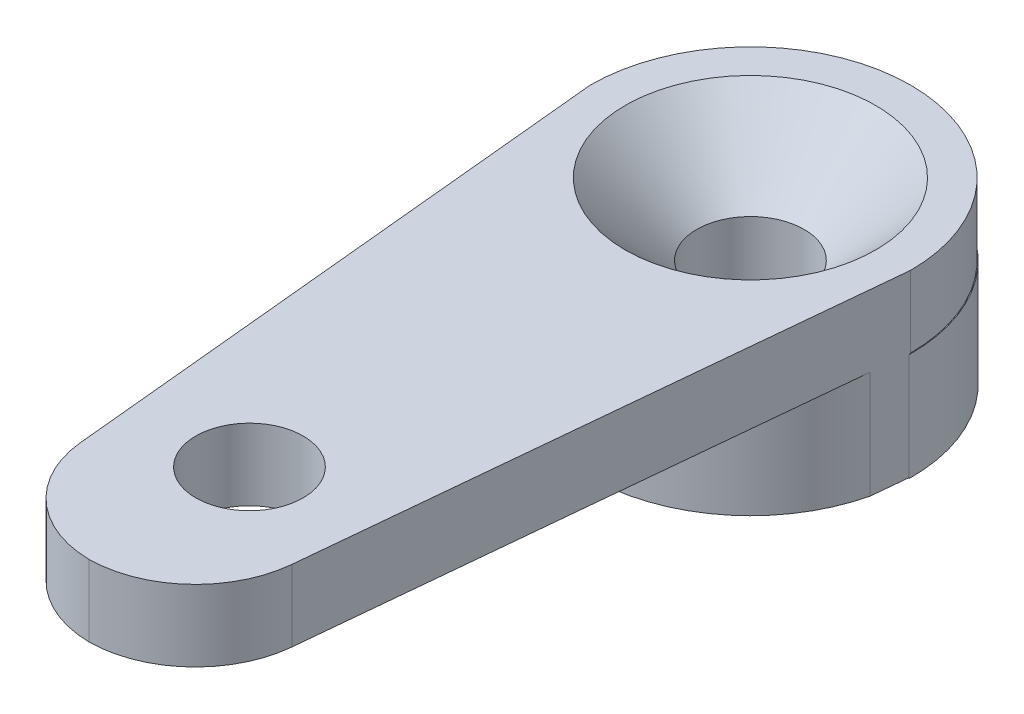
ISO-10303-21;
HEADER;
FILE_DESCRIPTION(('STEP AP214'),'2;1');
FILE_NAME('part.step','',(''),(''),'','','');
FILE_SCHEMA(('AUTOMOTIVE_DESIGN { 1 0 10303 214 1 1 1 1 }'));
ENDSEC;
DATA;
#1=APPLICATION_CONTEXT('core data for automotive mechanical design processes');
#2=APPLICATION_PROTOCOL_DEFINITION('international standard','automotive_design',2000,#1);
#3=PRODUCT_CONTEXT('',#1,'mechanical');
#4=PRODUCT('Part','Part','',(#3));
#5=PRODUCT_RELATED_PRODUCT_CATEGORY('part','',(#4));
#6=PRODUCT_DEFINITION_FORMATION('','',#4);
#7=PRODUCT_DEFINITION_CONTEXT('part definition',#1,'design');
#8=PRODUCT_DEFINITION('design','',#6,#7);
#9=PRODUCT_DEFINITION_SHAPE('','',#8);
#10=(LENGTH_UNIT() NAMED_UNIT(*) SI_UNIT(.MILLI.,.METRE.));
#11=(NAMED_UNIT(*) PLANE_ANGLE_UNIT() SI_UNIT($,.RADIAN.));
#12=(NAMED_UNIT(*) SI_UNIT($,.STERADIAN.) SOLID_ANGLE_UNIT());
#13=UNCERTAINTY_MEASURE_WITH_UNIT(LENGTH_MEASURE(1.E-05),#10,'distance_accuracy_value','');
#14=(GEOMETRIC_REPRESENTATION_CONTEXT(3) GLOBAL_UNCERTAINTY_ASSIGNED_CONTEXT((#13)) GLOBAL_UNIT_ASSIGNED_CONTEXT((#10,
#11,#12)) REPRESENTATION_CONTEXT('',''));
#15=CARTESIAN_POINT('',(0.,0.,0.));
#16=DIRECTION('',(0.,0.,1.));
#17=DIRECTION('',(1.,0.,0.));
#18=AXIS2_PLACEMENT_3D('',#15,#16,#17);
#19=CARTESIAN_POINT('',(0.,3.,0.));
#20=DIRECTION('',(0.,-1.,0.));
#21=DIRECTION('',(0.,0.,-1.));
#22=AXIS2_PLACEMENT_3D('',#19,#20,#21);
#23=CYLINDRICAL_SURFACE('',#22,4.5);
#24=CARTESIAN_POINT('',(0.,3.,0.));
#25=DIRECTION('',(0.,1.,0.));
#26=DIRECTION('',(0.,0.,1.));
#27=AXIS2_PLACEMENT_3D('',#24,#25,#26);
#28=CIRCLE('',#27,4.5);
#29=CARTESIAN_POINT('',(4.49955660508697,3.,0.0631692774870343));
#30=VERTEX_POINT('',#29);
#31=CARTESIAN_POINT('',(-4.49981233239338,3.,0.0410971196130826));
#32=VERTEX_POINT('',#31);
#33=EDGE_CURVE('E168',#30,#32,#28,.T.);
#34=ORIENTED_EDGE('',*,*,#33,.F.);
#35=DIRECTION('',(0.,-1.,0.));
#36=VECTOR('',#35,1.);
#37=CARTESIAN_POINT('',(4.49955660508697,3.,0.0631692774870343));
#38=LINE('',#37,#36);
#39=CARTESIAN_POINT('',(4.49955660508697,0.,0.0631692774870291));
#40=VERTEX_POINT('',#39);
#41=EDGE_CURVE('E248',#30,#40,#38,.T.);
#42=ORIENTED_EDGE('',*,*,#41,.T.);
#43=CARTESIAN_POINT('',(0.,0.,0.));
#44=DIRECTION('',(0.,1.,0.));
#45=DIRECTION('',(0.,0.,1.));
#46=AXIS2_PLACEMENT_3D('',#43,#44,#45);
#47=CIRCLE('',#46,4.5);
#48=CARTESIAN_POINT('',(-4.49981233239338,0.,0.0410971196130806));
#49=VERTEX_POINT('',#48);
#50=EDGE_CURVE('E163',#40,#49,#47,.T.);
#51=ORIENTED_EDGE('',*,*,#50,.T.);
#52=DIRECTION('',(0.,-1.,0.));
#53=VECTOR('',#52,1.);
#54=CARTESIAN_POINT('',(-4.49981233239338,3.,0.0410971196130826));
#55=LINE('',#54,#53);
#56=EDGE_CURVE('E259',#49,#32,#55,.F.);
#57=ORIENTED_EDGE('',*,*,#56,.T.);
#58=EDGE_LOOP('',(#34,#42,#51,#57));
#59=FACE_BOUND('',#58,.T.);
#60=ADVANCED_FACE('F50',(#59),#23,.T.);
#61=CARTESIAN_POINT('',(-4.37934467093334,0.,1.0350556763613));
#62=VERTEX_POINT('',#61);
#63=CARTESIAN_POINT('',(4.37934467093334,0.,1.0350556763613));
#64=VERTEX_POINT('',#63);
#65=EDGE_CURVE('E158',#62,#64,#47,.T.);
#66=ORIENTED_EDGE('',*,*,#65,.T.);
#67=DIRECTION('',(0.,-1.,0.));
#68=VECTOR('',#67,1.);
#69=CARTESIAN_POINT('',(4.37934467093334,3.,1.0350556763613));
#70=LINE('',#69,#68);
#71=CARTESIAN_POINT('',(4.37934467093335,3.,1.03505567636129));
#72=VERTEX_POINT('',#71);
#73=EDGE_CURVE('E236',#64,#72,#70,.F.);
#74=ORIENTED_EDGE('',*,*,#73,.T.);
#75=CARTESIAN_POINT('',(-4.37934467093334,3.,1.0350556763613));
#76=VERTEX_POINT('',#75);
#77=EDGE_CURVE('E172',#76,#72,#28,.T.);
#78=ORIENTED_EDGE('',*,*,#77,.F.);
#79=DIRECTION('',(0.,-1.,0.));
#80=VECTOR('',#79,1.);
#81=CARTESIAN_POINT('',(-4.37934467093334,3.,1.0350556763613));
#82=LINE('',#81,#80);
#83=EDGE_CURVE('E200',#76,#62,#82,.T.);
#84=ORIENTED_EDGE('',*,*,#83,.T.);
#85=EDGE_LOOP('',(#66,#74,#78,#84));
#86=FACE_BOUND('',#85,.T.);
#87=ADVANCED_FACE('F291',(#86),#23,.T.);
#88=CARTESIAN_POINT('',(0.,3.,0.));
#89=DIRECTION('',(0.,1.,0.));
#90=DIRECTION('',(0.,0.,1.));
#91=AXIS2_PLACEMENT_3D('',#88,#89,#90);
#92=PLANE('',#91);
#93=DIRECTION('',(-0.299614813266294,0.,-0.954060251593894));
#94=VECTOR('',#93,1.);
#95=CARTESIAN_POINT('',(4.07757876987385,3.,-1.28053023870697));
#96=LINE('',#95,#94);
#97=CARTESIAN_POINT('',(4.47971881051705,3.,0.));
#98=VERTEX_POINT('',#97);
#99=EDGE_CURVE('E252',#30,#98,#96,.T.);
#100=ORIENTED_EDGE('',*,*,#99,.F.);
#101=ORIENTED_EDGE('',*,*,#33,.T.);
#102=DIRECTION('',(-0.439238302679607,0.,0.898370588042117));
#103=VECTOR('',#102,1.);
#104=CARTESIAN_POINT('',(-3.61544537678151,3.,-1.76769154273992));
#105=LINE('',#104,#103);
#106=CARTESIAN_POINT('',(-4.47971881051705,3.,0.));
#107=VERTEX_POINT('',#106);
#108=EDGE_CURVE('E263',#107,#32,#105,.T.);
#109=ORIENTED_EDGE('',*,*,#108,.F.);
#110=CARTESIAN_POINT('',(0.,3.,0.));
#111=DIRECTION('',(0.,1.,0.));
#112=DIRECTION('',(0.,0.,1.));
#113=AXIS2_PLACEMENT_3D('',#110,#111,#112);
#114=CIRCLE('',#113,4.47971881051705);
#115=EDGE_CURVE('E152',#98,#107,#114,.T.);
#116=ORIENTED_EDGE('',*,*,#115,.F.);
#117=EDGE_LOOP('',(#100,#101,#109,#116));
#118=FACE_BOUND('',#117,.T.);
#119=ADVANCED_FACE('F298',(#118),#92,.T.);
#120=CARTESIAN_POINT('',(0.,0.,0.));
#121=DIRECTION('',(0.,1.,0.));
#122=DIRECTION('',(0.,0.,1.));
#123=AXIS2_PLACEMENT_3D('',#120,#121,#122);
#124=PLANE('',#123);
#125=CARTESIAN_POINT('',(0.,0.,0.));
#126=DIRECTION('',(0.,1.,0.));
#127=DIRECTION('',(0.,0.,1.));
#128=AXIS2_PLACEMENT_3D('',#125,#126,#127);
#129=CIRCLE('',#128,1.5);
#130=CARTESIAN_POINT('',(0.,0.,1.5));
#131=VERTEX_POINT('',#130);
#132=EDGE_CURVE('E266',#131,#131,#129,.T.);
#133=ORIENTED_EDGE('',*,*,#132,.T.);
#134=EDGE_LOOP('',(#133));
#135=FACE_BOUND('',#134,.T.);
#136=ORIENTED_EDGE('',*,*,#50,.F.);
#137=DIRECTION('',(-0.299614813266294,0.,-0.954060251593894));
#138=VECTOR('',#137,1.);
#139=CARTESIAN_POINT('',(4.07757876987385,0.,-1.28053023870697));
#140=LINE('',#139,#138);
#141=CARTESIAN_POINT('',(4.47971881051705,0.,0.));
#142=VERTEX_POINT('',#141);
#143=EDGE_CURVE('E244',#40,#142,#140,.T.);
#144=ORIENTED_EDGE('',*,*,#143,.T.);
#145=DIRECTION('',(-0.0965218409295913,0.,0.995330866708937));
#146=VECTOR('',#145,1.);
#147=CARTESIAN_POINT('',(4.43798366353081,0.,0.430371816595848));
#148=LINE('',#147,#146);
#149=EDGE_CURVE('E240',#142,#64,#148,.T.);
#150=ORIENTED_EDGE('',*,*,#149,.T.);
#151=ORIENTED_EDGE('',*,*,#65,.F.);
#152=DIRECTION('',(-0.0965218409295915,0.,-0.995330866708936));
#153=VECTOR('',#152,1.);
#154=CARTESIAN_POINT('',(-4.4379836635308,0.,0.430371816595849));
#155=LINE('',#154,#153);
#156=CARTESIAN_POINT('',(-4.47971881051705,0.,0.));
#157=VERTEX_POINT('',#156);
#158=EDGE_CURVE('E229',#62,#157,#155,.T.);
#159=ORIENTED_EDGE('',*,*,#158,.T.);
#160=DIRECTION('',(-0.439238302679607,0.,0.898370588042117));
#161=VECTOR('',#160,1.);
#162=CARTESIAN_POINT('',(-3.61544537678151,0.,-1.76769154273992));
#163=LINE('',#162,#161);
#164=EDGE_CURVE('E255',#157,#49,#163,.T.);
#165=ORIENTED_EDGE('',*,*,#164,.T.);
#166=EDGE_LOOP('',(#136,#144,#150,#151,#159,#165));
#167=FACE_BOUND('',#166,.T.);
#168=ADVANCED_FACE('F272',(#135,#167),#124,.F.);
#169=CARTESIAN_POINT('',(0.,3.,0.));
#170=DIRECTION('',(0.,1.,0.));
#171=DIRECTION('',(0.,0.,1.));
#172=AXIS2_PLACEMENT_3D('',#169,#170,#171);
#173=PLANE('',#172);
#174=CARTESIAN_POINT('',(0.,3.,14.));
#175=DIRECTION('',(0.,1.,0.));
#176=DIRECTION('',(0.,0.,1.));
#177=AXIS2_PLACEMENT_3D('',#174,#175,#176);
#178=CIRCLE('',#177,1.5);
#179=CARTESIAN_POINT('',(0.,3.,15.5));
#180=VERTEX_POINT('',#179);
#181=EDGE_CURVE('E209',#180,#180,#178,.T.);
#182=ORIENTED_EDGE('',*,*,#181,.T.);
#183=EDGE_LOOP('',(#182));
#184=FACE_BOUND('',#183,.T.);
#185=CARTESIAN_POINT('',(-0.0354530852805608,3.,15.479294033295));
#186=DIRECTION('',(0.,1.,0.));
#187=DIRECTION('',(0.,0.,1.));
#188=AXIS2_PLACEMENT_3D('',#185,#186,#187);
#189=CIRCLE('',#188,3.);
#190=CARTESIAN_POINT('',(2.95053951484625,3.,15.7688595560837));
#191=VERTEX_POINT('',#190);
#192=CARTESIAN_POINT('',(0.,3.,18.4790845391043));
#193=VERTEX_POINT('',#192);
#194=EDGE_CURVE('E67',#191,#193,#189,.F.);
#195=ORIENTED_EDGE('',*,*,#194,.T.);
#196=CARTESIAN_POINT('',(0.0354530852805656,3.,15.479294033295));
#197=DIRECTION('',(0.,1.,0.));
#198=DIRECTION('',(0.,0.,1.));
#199=AXIS2_PLACEMENT_3D('',#196,#197,#198);
#200=CIRCLE('',#199,3.);
#201=CARTESIAN_POINT('',(-2.95053951484624,3.,15.7688595560837));
#202=VERTEX_POINT('',#201);
#203=EDGE_CURVE('E60',#193,#202,#200,.F.);
#204=ORIENTED_EDGE('',*,*,#203,.T.);
#205=DIRECTION('',(-0.0965218409295915,0.,-0.995330866708936));
#206=VECTOR('',#205,1.);
#207=CARTESIAN_POINT('',(-4.4379836635308,3.,0.430371816595849));
#208=LINE('',#207,#206);
#209=EDGE_CURVE('E195',#202,#76,#208,.T.);
#210=ORIENTED_EDGE('',*,*,#209,.T.);
#211=ORIENTED_EDGE('',*,*,#77,.T.);
#212=DIRECTION('',(-0.0965218409295913,0.,0.995330866708937));
#213=VECTOR('',#212,1.);
#214=CARTESIAN_POINT('',(4.43798366353081,3.,0.430371816595848));
#215=LINE('',#214,#213);
#216=EDGE_CURVE('E233',#72,#191,#215,.T.);
#217=ORIENTED_EDGE('',*,*,#216,.T.);
#218=EDGE_LOOP('',(#195,#204,#210,#211,#217));
#219=FACE_BOUND('',#218,.T.);
#220=ADVANCED_FACE('F193',(#184,#219),#173,.F.);
#221=CARTESIAN_POINT('',(0.,5.,0.));
#222=DIRECTION('',(0.,-1.,0.));
#223=DIRECTION('',(0.,0.,-1.));
#224=AXIS2_PLACEMENT_3D('',#221,#222,#223);
#225=CYLINDRICAL_SURFACE('',#224,4.47971881051705);
#226=ORIENTED_EDGE('',*,*,#115,.T.);
#227=DIRECTION('',(0.,-1.,0.));
#228=VECTOR('',#227,1.);
#229=CARTESIAN_POINT('',(-4.47971881051705,5.,0.));
#230=LINE('',#229,#228);
#231=CARTESIAN_POINT('',(-4.47971881051705,5.,0.));
#232=VERTEX_POINT('',#231);
#233=EDGE_CURVE('E134',#232,#107,#230,.T.);
#234=ORIENTED_EDGE('',*,*,#233,.F.);
#235=CARTESIAN_POINT('',(0.,5.,0.));
#236=DIRECTION('',(0.,1.,0.));
#237=DIRECTION('',(0.,0.,1.));
#238=AXIS2_PLACEMENT_3D('',#235,#236,#237);
#239=CIRCLE('',#238,4.47971881051705);
#240=CARTESIAN_POINT('',(4.47971881051705,5.,0.));
#241=VERTEX_POINT('',#240);
#242=EDGE_CURVE('E144',#241,#232,#239,.T.);
#243=ORIENTED_EDGE('',*,*,#242,.F.);
#244=DIRECTION('',(0.,-1.,0.));
#245=VECTOR('',#244,1.);
#246=CARTESIAN_POINT('',(4.47971881051705,5.,0.));
#247=LINE('',#246,#245);
#248=EDGE_CURVE('E151',#241,#98,#247,.T.);
#249=ORIENTED_EDGE('',*,*,#248,.T.);
#250=EDGE_LOOP('',(#226,#234,#243,#249));
#251=FACE_BOUND('',#250,.T.);
#252=ADVANCED_FACE('F155',(#251),#225,.T.);
#253=CARTESIAN_POINT('',(0.,5.,0.));
#254=DIRECTION('',(0.,1.,0.));
#255=DIRECTION('',(0.,0.,1.));
#256=AXIS2_PLACEMENT_3D('',#253,#254,#255);
#257=PLANE('',#256);
#258=CARTESIAN_POINT('',(0.,5.,14.));
#259=DIRECTION('',(0.,1.,0.));
#260=DIRECTION('',(0.,0.,1.));
#261=AXIS2_PLACEMENT_3D('',#258,#259,#260);
#262=CIRCLE('',#261,1.5);
#263=CARTESIAN_POINT('',(0.,5.,15.5));
#264=VERTEX_POINT('',#263);
#265=EDGE_CURVE('E212',#264,#264,#262,.T.);
#266=ORIENTED_EDGE('',*,*,#265,.F.);
#267=EDGE_LOOP('',(#266));
#268=FACE_BOUND('',#267,.T.);
#269=DIRECTION('',(-0.0965218409295915,0.,-0.995330866708936));
#270=VECTOR('',#269,1.);
#271=CARTESIAN_POINT('',(-4.47971881051705,5.,0.));
#272=LINE('',#271,#270);
#273=CARTESIAN_POINT('',(-2.95053951484624,5.,15.7688595560837));
#274=VERTEX_POINT('',#273);
#275=EDGE_CURVE('E128',#274,#232,#272,.T.);
#276=ORIENTED_EDGE('',*,*,#275,.F.);
#277=CARTESIAN_POINT('',(0.0354530852805656,5.,15.479294033295));
#278=DIRECTION('',(0.,1.,0.));
#279=DIRECTION('',(0.,0.,1.));
#280=AXIS2_PLACEMENT_3D('',#277,#278,#279);
#281=CIRCLE('',#280,3.);
#282=CARTESIAN_POINT('',(0.,5.,18.4790845391043));
#283=VERTEX_POINT('',#282);
#284=EDGE_CURVE('E186',#274,#283,#281,.T.);
#285=ORIENTED_EDGE('',*,*,#284,.T.);
#286=CARTESIAN_POINT('',(-0.0354530852805608,5.,15.479294033295));
#287=DIRECTION('',(0.,1.,0.));
#288=DIRECTION('',(0.,0.,1.));
#289=AXIS2_PLACEMENT_3D('',#286,#287,#288);
#290=CIRCLE('',#289,3.);
#291=CARTESIAN_POINT('',(2.95053951484625,5.,15.7688595560837));
#292=VERTEX_POINT('',#291);
#293=EDGE_CURVE('E183',#283,#292,#290,.T.);
#294=ORIENTED_EDGE('',*,*,#293,.T.);
#295=DIRECTION('',(-0.0965218409295912,0.,0.995330866708936));
#296=VECTOR('',#295,1.);
#297=CARTESIAN_POINT('',(4.47971881051705,5.,0.));
#298=LINE('',#297,#296);
#299=EDGE_CURVE('E147',#241,#292,#298,.T.);
#300=ORIENTED_EDGE('',*,*,#299,.F.);
#301=ORIENTED_EDGE('',*,*,#242,.T.);
#302=EDGE_LOOP('',(#276,#285,#294,#300,#301));
#303=FACE_BOUND('',#302,.T.);
#304=CARTESIAN_POINT('',(0.,5.,0.));
#305=DIRECTION('',(0.,1.,0.));
#306=DIRECTION('',(0.,0.,1.));
#307=AXIS2_PLACEMENT_3D('',#304,#305,#306);
#308=CIRCLE('',#307,3.50000000000001);
#309=CARTESIAN_POINT('',(0.,5.,3.50000000000001));
#310=VERTEX_POINT('',#309);
#311=EDGE_CURVE('E177',#310,#310,#308,.F.);
#312=ORIENTED_EDGE('',*,*,#311,.T.);
#313=EDGE_LOOP('',(#312));
#314=FACE_BOUND('',#313,.T.);
#315=ADVANCED_FACE('F145',(#268,#303,#314),#257,.T.);
#316=CARTESIAN_POINT('',(0.,-27.,0.));
#317=DIRECTION('',(0.,1.,0.));
#318=DIRECTION('',(0.,0.,1.));
#319=AXIS2_PLACEMENT_3D('',#316,#317,#318);
#320=CYLINDRICAL_SURFACE('',#319,1.5);
#321=CARTESIAN_POINT('',(0.,3.,0.));
#322=DIRECTION('',(0.,1.,0.));
#323=DIRECTION('',(0.,0.,1.));
#324=AXIS2_PLACEMENT_3D('',#321,#322,#323);
#325=CIRCLE('',#324,1.5);
#326=CARTESIAN_POINT('',(0.,3.,1.5));
#327=VERTEX_POINT('',#326);
#328=EDGE_CURVE('E171',#327,#327,#325,.T.);
#329=ORIENTED_EDGE('',*,*,#328,.T.);
#330=EDGE_LOOP('',(#329));
#331=FACE_BOUND('',#330,.T.);
#332=ORIENTED_EDGE('',*,*,#132,.F.);
#333=EDGE_LOOP('',(#332));
#334=FACE_BOUND('',#333,.T.);
#335=ADVANCED_FACE('F275',(#331,#334),#320,.F.);
#336=CARTESIAN_POINT('',(0.,3.,0.));
#337=DIRECTION('',(0.,1.,0.));
#338=DIRECTION('',(0.,0.,1.));
#339=AXIS2_PLACEMENT_3D('',#336,#337,#338);
#340=CONICAL_SURFACE('',#339,1.5,0.785398163397449);
#341=ORIENTED_EDGE('',*,*,#311,.F.);
#342=EDGE_LOOP('',(#341));
#343=FACE_BOUND('',#342,.T.);
#344=ORIENTED_EDGE('',*,*,#328,.F.);
#345=EDGE_LOOP('',(#344));
#346=FACE_BOUND('',#345,.T.);
#347=ADVANCED_FACE('F277',(#343,#346),#340,.F.);
#348=CARTESIAN_POINT('',(-4.47971881051705,-27.,0.));
#349=DIRECTION('',(0.995330866708936,0.,-0.0965218409295915));
#350=DIRECTION('',(-0.0965218409295915,0.,-0.995330866708936));
#351=AXIS2_PLACEMENT_3D('',#348,#349,#350);
#352=PLANE('',#351);
#353=ORIENTED_EDGE('',*,*,#209,.F.);
#354=DIRECTION('',(0.,-1.,0.));
#355=VECTOR('',#354,1.);
#356=CARTESIAN_POINT('',(-2.95053951484624,-27.,15.7688595560837));
#357=LINE('',#356,#355);
#358=EDGE_CURVE('E137',#202,#274,#357,.F.);
#359=ORIENTED_EDGE('',*,*,#358,.T.);
#360=ORIENTED_EDGE('',*,*,#275,.T.);
#361=ORIENTED_EDGE('',*,*,#233,.T.);
#362=DIRECTION('',(0.,1.,0.));
#363=VECTOR('',#362,1.);
#364=CARTESIAN_POINT('',(-4.47971881051705,-27.,0.));
#365=LINE('',#364,#363);
#366=EDGE_CURVE('E140',#157,#107,#365,.T.);
#367=ORIENTED_EDGE('',*,*,#366,.F.);
#368=ORIENTED_EDGE('',*,*,#158,.F.);
#369=ORIENTED_EDGE('',*,*,#83,.F.);
#370=EDGE_LOOP('',(#353,#359,#360,#361,#367,#368,#369));
#371=FACE_BOUND('',#370,.T.);
#372=ADVANCED_FACE('F131',(#371),#352,.F.);
#373=CARTESIAN_POINT('',(-4.47971881051705,-27.,0.));
#374=DIRECTION('',(-0.898370588042117,0.,-0.439238302679607));
#375=DIRECTION('',(-0.439238302679607,0.,0.898370588042117));
#376=AXIS2_PLACEMENT_3D('',#373,#374,#375);
#377=PLANE('',#376);
#378=ORIENTED_EDGE('',*,*,#108,.T.);
#379=ORIENTED_EDGE('',*,*,#56,.F.);
#380=ORIENTED_EDGE('',*,*,#164,.F.);
#381=ORIENTED_EDGE('',*,*,#366,.T.);
#382=EDGE_LOOP('',(#378,#379,#380,#381));
#383=FACE_BOUND('',#382,.T.);
#384=ADVANCED_FACE('F321',(#383),#377,.F.);
#385=CARTESIAN_POINT('',(4.47971881051705,-27.,0.));
#386=DIRECTION('',(-0.995330866708936,0.,-0.0965218409295912));
#387=DIRECTION('',(-0.0965218409295913,0.,0.995330866708937));
#388=AXIS2_PLACEMENT_3D('',#385,#386,#387);
#389=PLANE('',#388);
#390=ORIENTED_EDGE('',*,*,#299,.T.);
#391=DIRECTION('',(0.,-1.,0.));
#392=VECTOR('',#391,1.);
#393=CARTESIAN_POINT('',(2.95053951484625,-27.,15.7688595560837));
#394=LINE('',#393,#392);
#395=EDGE_CURVE('E13',#292,#191,#394,.T.);
#396=ORIENTED_EDGE('',*,*,#395,.T.);
#397=ORIENTED_EDGE('',*,*,#216,.F.);
#398=ORIENTED_EDGE('',*,*,#73,.F.);
#399=ORIENTED_EDGE('',*,*,#149,.F.);
#400=DIRECTION('',(0.,1.,0.));
#401=VECTOR('',#400,1.);
#402=CARTESIAN_POINT('',(4.47971881051705,-27.,0.));
#403=LINE('',#402,#401);
#404=EDGE_CURVE('E203',#142,#98,#403,.T.);
#405=ORIENTED_EDGE('',*,*,#404,.T.);
#406=ORIENTED_EDGE('',*,*,#248,.F.);
#407=EDGE_LOOP('',(#390,#396,#397,#398,#399,#405,#406));
#408=FACE_BOUND('',#407,.T.);
#409=ADVANCED_FACE('F315',(#408),#389,.F.);
#410=CARTESIAN_POINT('',(4.47971881051705,-27.,0.));
#411=DIRECTION('',(0.954060251593894,0.,-0.299614813266294));
#412=DIRECTION('',(-0.299614813266294,0.,-0.954060251593894));
#413=AXIS2_PLACEMENT_3D('',#410,#411,#412);
#414=PLANE('',#413);
#415=ORIENTED_EDGE('',*,*,#99,.T.);
#416=ORIENTED_EDGE('',*,*,#404,.F.);
#417=ORIENTED_EDGE('',*,*,#143,.F.);
#418=ORIENTED_EDGE('',*,*,#41,.F.);
#419=EDGE_LOOP('',(#415,#416,#417,#418));
#420=FACE_BOUND('',#419,.T.);
#421=ADVANCED_FACE('F311',(#420),#414,.F.);
#422=CARTESIAN_POINT('',(-0.0354530852805608,5.,15.479294033295));
#423=DIRECTION('',(0.,-1.,0.));
#424=DIRECTION('',(0.,0.,-1.));
#425=AXIS2_PLACEMENT_3D('',#422,#423,#424);
#426=CYLINDRICAL_SURFACE('',#425,3.);
#427=DIRECTION('',(0.,-1.,0.));
#428=VECTOR('',#427,1.);
#429=CARTESIAN_POINT('',(0.,4.,18.4790845391043));
#430=LINE('',#429,#428);
#431=EDGE_CURVE('E54',#193,#283,#430,.F.);
#432=ORIENTED_EDGE('',*,*,#431,.F.);
#433=ORIENTED_EDGE('',*,*,#194,.F.);
#434=ORIENTED_EDGE('',*,*,#395,.F.);
#435=ORIENTED_EDGE('',*,*,#293,.F.);
#436=EDGE_LOOP('',(#432,#433,#434,#435));
#437=FACE_BOUND('',#436,.T.);
#438=ADVANCED_FACE('F52',(#437),#426,.T.);
#439=CARTESIAN_POINT('',(0.0354530852805656,5.,15.479294033295));
#440=DIRECTION('',(0.,-1.,0.));
#441=DIRECTION('',(0.,0.,-1.));
#442=AXIS2_PLACEMENT_3D('',#439,#440,#441);
#443=CYLINDRICAL_SURFACE('',#442,3.);
#444=ORIENTED_EDGE('',*,*,#203,.F.);
#445=ORIENTED_EDGE('',*,*,#431,.T.);
#446=ORIENTED_EDGE('',*,*,#284,.F.);
#447=ORIENTED_EDGE('',*,*,#358,.F.);
#448=EDGE_LOOP('',(#444,#445,#446,#447));
#449=FACE_BOUND('',#448,.T.);
#450=ADVANCED_FACE('F205',(#449),#443,.T.);
#451=CARTESIAN_POINT('',(0.,3.,14.));
#452=DIRECTION('',(0.,1.,0.));
#453=DIRECTION('',(0.,0.,1.));
#454=AXIS2_PLACEMENT_3D('',#451,#452,#453);
#455=CYLINDRICAL_SURFACE('',#454,1.5);
#456=ORIENTED_EDGE('',*,*,#181,.F.);
#457=EDGE_LOOP('',(#456));
#458=FACE_BOUND('',#457,.T.);
#459=ORIENTED_EDGE('',*,*,#265,.T.);
#460=EDGE_LOOP('',(#459));
#461=FACE_BOUND('',#460,.T.);
#462=ADVANCED_FACE('F304',(#458,#461),#455,.F.);
#463=CLOSED_SHELL('',(#60,#87,#119,#168,#220,#252,#315,#335,#347,#372,#384,#409,#421,#438,#450,#462));
#464=MANIFOLD_SOLID_BREP('B2',#463);
#465=ADVANCED_BREP_SHAPE_REPRESENTATION('',(#18,#464),#14);
#466=SHAPE_DEFINITION_REPRESENTATION(#9,#465);
ENDSEC;
END-ISO-10303-21;
